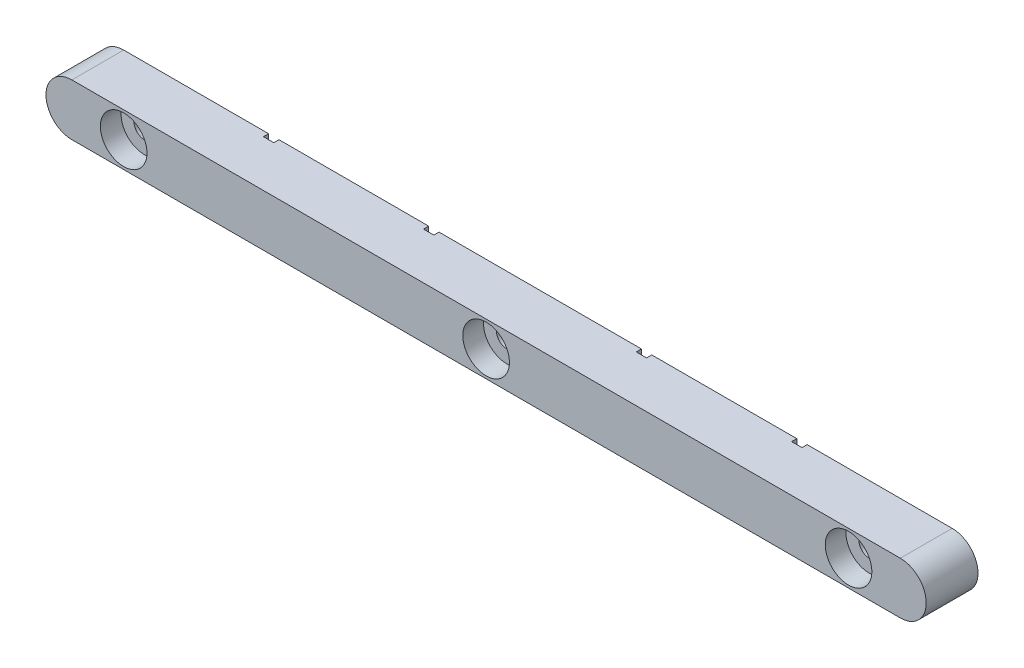
ISO-10303-21;
HEADER;
FILE_DESCRIPTION(('STEP AP214'),'2;1');
FILE_NAME('part.step','',(''),(''),'','','');
FILE_SCHEMA(('AUTOMOTIVE_DESIGN { 1 0 10303 214 1 1 1 1 }'));
ENDSEC;
DATA;
#1=APPLICATION_CONTEXT('core data for automotive mechanical design processes');
#2=APPLICATION_PROTOCOL_DEFINITION('international standard','automotive_design',2000,#1);
#3=PRODUCT_CONTEXT('',#1,'mechanical');
#4=PRODUCT('Part','Part','',(#3));
#5=PRODUCT_RELATED_PRODUCT_CATEGORY('part','',(#4));
#6=PRODUCT_DEFINITION_FORMATION('','',#4);
#7=PRODUCT_DEFINITION_CONTEXT('part definition',#1,'design');
#8=PRODUCT_DEFINITION('design','',#6,#7);
#9=PRODUCT_DEFINITION_SHAPE('','',#8);
#10=(LENGTH_UNIT() NAMED_UNIT(*) SI_UNIT(.MILLI.,.METRE.));
#11=(NAMED_UNIT(*) PLANE_ANGLE_UNIT() SI_UNIT($,.RADIAN.));
#12=(NAMED_UNIT(*) SI_UNIT($,.STERADIAN.) SOLID_ANGLE_UNIT());
#13=UNCERTAINTY_MEASURE_WITH_UNIT(LENGTH_MEASURE(1.E-05),#10,'distance_accuracy_value','');
#14=(GEOMETRIC_REPRESENTATION_CONTEXT(3) GLOBAL_UNCERTAINTY_ASSIGNED_CONTEXT((#13)) GLOBAL_UNIT_ASSIGNED_CONTEXT((#10,
#11,#12)) REPRESENTATION_CONTEXT('',''));
#15=CARTESIAN_POINT('',(0.,0.,0.));
#16=DIRECTION('',(0.,0.,1.));
#17=DIRECTION('',(1.,0.,0.));
#18=AXIS2_PLACEMENT_3D('',#15,#16,#17);
#19=CARTESIAN_POINT('',(-34.9999999999983,0.,5.));
#20=DIRECTION('',(0.,0.,-1.));
#21=DIRECTION('',(-1.,0.,0.));
#22=AXIS2_PLACEMENT_3D('',#19,#20,#21);
#23=CYLINDRICAL_SURFACE('',#22,0.999999999999998);
#24=CARTESIAN_POINT('',(-34.9999999999983,0.,0.));
#25=DIRECTION('',(0.,0.,1.));
#26=DIRECTION('',(1.,0.,0.));
#27=AXIS2_PLACEMENT_3D('',#24,#25,#26);
#28=CIRCLE('',#27,0.999999999999998);
#29=CARTESIAN_POINT('',(-33.9999999999983,0.,0.));
#30=VERTEX_POINT('',#29);
#31=EDGE_CURVE('E293',#30,#30,#28,.T.);
#32=ORIENTED_EDGE('',*,*,#31,.F.);
#33=EDGE_LOOP('',(#32));
#34=FACE_BOUND('',#33,.T.);
#35=CARTESIAN_POINT('',(-34.9999999999983,0.,3.));
#36=DIRECTION('',(0.,0.,1.));
#37=DIRECTION('',(1.,0.,0.));
#38=AXIS2_PLACEMENT_3D('',#35,#36,#37);
#39=CIRCLE('',#38,0.999999999999998);
#40=CARTESIAN_POINT('',(-33.9999999999983,0.,3.));
#41=VERTEX_POINT('',#40);
#42=EDGE_CURVE('E45',#41,#41,#39,.T.);
#43=ORIENTED_EDGE('',*,*,#42,.T.);
#44=EDGE_LOOP('',(#43));
#45=FACE_BOUND('',#44,.T.);
#46=ADVANCED_FACE('F41',(#34,#45),#23,.F.);
#47=CARTESIAN_POINT('',(0.,0.,5.));
#48=DIRECTION('',(0.,0.,-1.));
#49=DIRECTION('',(-1.,0.,0.));
#50=AXIS2_PLACEMENT_3D('',#47,#48,#49);
#51=CYLINDRICAL_SURFACE('',#50,1.);
#52=CARTESIAN_POINT('',(0.,0.,0.));
#53=DIRECTION('',(0.,0.,1.));
#54=DIRECTION('',(1.,0.,0.));
#55=AXIS2_PLACEMENT_3D('',#52,#53,#54);
#56=CIRCLE('',#55,1.);
#57=CARTESIAN_POINT('',(1.,0.,0.));
#58=VERTEX_POINT('',#57);
#59=EDGE_CURVE('E290',#58,#58,#56,.T.);
#60=ORIENTED_EDGE('',*,*,#59,.F.);
#61=EDGE_LOOP('',(#60));
#62=FACE_BOUND('',#61,.T.);
#63=CARTESIAN_POINT('',(0.,0.,3.));
#64=DIRECTION('',(0.,0.,1.));
#65=DIRECTION('',(1.,0.,0.));
#66=AXIS2_PLACEMENT_3D('',#63,#64,#65);
#67=CIRCLE('',#66,1.);
#68=CARTESIAN_POINT('',(1.,0.,3.));
#69=VERTEX_POINT('',#68);
#70=EDGE_CURVE('E330',#69,#69,#67,.T.);
#71=ORIENTED_EDGE('',*,*,#70,.T.);
#72=EDGE_LOOP('',(#71));
#73=FACE_BOUND('',#72,.T.);
#74=ADVANCED_FACE('F444',(#62,#73),#51,.F.);
#75=CARTESIAN_POINT('',(34.9999999999983,0.,5.));
#76=DIRECTION('',(0.,0.,-1.));
#77=DIRECTION('',(-1.,0.,0.));
#78=AXIS2_PLACEMENT_3D('',#75,#76,#77);
#79=CYLINDRICAL_SURFACE('',#78,0.999999999999998);
#80=CARTESIAN_POINT('',(34.9999999999983,0.,0.));
#81=DIRECTION('',(0.,0.,1.));
#82=DIRECTION('',(1.,0.,0.));
#83=AXIS2_PLACEMENT_3D('',#80,#81,#82);
#84=CIRCLE('',#83,0.999999999999998);
#85=CARTESIAN_POINT('',(35.9999999999983,0.,0.));
#86=VERTEX_POINT('',#85);
#87=EDGE_CURVE('E212',#86,#86,#84,.T.);
#88=ORIENTED_EDGE('',*,*,#87,.F.);
#89=EDGE_LOOP('',(#88));
#90=FACE_BOUND('',#89,.T.);
#91=CARTESIAN_POINT('',(34.9999999999983,0.,3.));
#92=DIRECTION('',(0.,0.,1.));
#93=DIRECTION('',(1.,0.,0.));
#94=AXIS2_PLACEMENT_3D('',#91,#92,#93);
#95=CIRCLE('',#94,0.999999999999998);
#96=CARTESIAN_POINT('',(35.9999999999983,0.,3.));
#97=VERTEX_POINT('',#96);
#98=EDGE_CURVE('E328',#97,#97,#95,.T.);
#99=ORIENTED_EDGE('',*,*,#98,.T.);
#100=EDGE_LOOP('',(#99));
#101=FACE_BOUND('',#100,.T.);
#102=ADVANCED_FACE('F435',(#90,#101),#79,.F.);
#103=CARTESIAN_POINT('',(-40.,0.,0.));
#104=DIRECTION('',(0.,0.,1.));
#105=DIRECTION('',(1.,0.,0.));
#106=AXIS2_PLACEMENT_3D('',#103,#104,#105);
#107=PLANE('',#106);
#108=ORIENTED_EDGE('',*,*,#87,.T.);
#109=EDGE_LOOP('',(#108));
#110=FACE_BOUND('',#109,.T.);
#111=DIRECTION('',(1.,0.,0.));
#112=VECTOR('',#111,1.);
#113=CARTESIAN_POINT('',(-40.,-2.5,0.));
#114=LINE('',#113,#112);
#115=CARTESIAN_POINT('',(26.,-2.5,0.));
#116=VERTEX_POINT('',#115);
#117=CARTESIAN_POINT('',(40.,-2.5,0.));
#118=VERTEX_POINT('',#117);
#119=EDGE_CURVE('E310',#116,#118,#114,.T.);
#120=ORIENTED_EDGE('',*,*,#119,.F.);
#121=DIRECTION('',(0.,-1.,0.));
#122=VECTOR('',#121,1.);
#123=CARTESIAN_POINT('',(26.,2.5,0.));
#124=LINE('',#123,#122);
#125=CARTESIAN_POINT('',(26.,2.5,0.));
#126=VERTEX_POINT('',#125);
#127=EDGE_CURVE('E186',#126,#116,#124,.T.);
#128=ORIENTED_EDGE('',*,*,#127,.F.);
#129=DIRECTION('',(-1.,0.,0.));
#130=VECTOR('',#129,1.);
#131=CARTESIAN_POINT('',(-40.,2.5,0.));
#132=LINE('',#131,#130);
#133=CARTESIAN_POINT('',(40.,2.5,0.));
#134=VERTEX_POINT('',#133);
#135=EDGE_CURVE('E301',#134,#126,#132,.T.);
#136=ORIENTED_EDGE('',*,*,#135,.F.);
#137=CARTESIAN_POINT('',(40.0000000920344,0.,0.));
#138=DIRECTION('',(0.,0.,1.));
#139=DIRECTION('',(-1.,0.,0.));
#140=AXIS2_PLACEMENT_3D('',#137,#138,#139);
#141=CIRCLE('',#140,2.5);
#142=EDGE_CURVE('E314',#118,#134,#141,.T.);
#143=ORIENTED_EDGE('',*,*,#142,.F.);
#144=EDGE_LOOP('',(#120,#128,#136,#143));
#145=FACE_BOUND('',#144,.T.);
#146=ADVANCED_FACE('F433',(#110,#145),#107,.F.);
#147=CARTESIAN_POINT('',(25.,2.5,0.));
#148=VERTEX_POINT('',#147);
#149=CARTESIAN_POINT('',(11.,2.5,0.));
#150=VERTEX_POINT('',#149);
#151=EDGE_CURVE('E320',#148,#150,#132,.T.);
#152=ORIENTED_EDGE('',*,*,#151,.F.);
#153=DIRECTION('',(0.,1.,0.));
#154=VECTOR('',#153,1.);
#155=CARTESIAN_POINT('',(25.,2.5,0.));
#156=LINE('',#155,#154);
#157=CARTESIAN_POINT('',(25.,-2.5,0.));
#158=VERTEX_POINT('',#157);
#159=EDGE_CURVE('E198',#158,#148,#156,.T.);
#160=ORIENTED_EDGE('',*,*,#159,.F.);
#161=CARTESIAN_POINT('',(11.,-2.5,0.));
#162=VERTEX_POINT('',#161);
#163=EDGE_CURVE('E418',#162,#158,#114,.T.);
#164=ORIENTED_EDGE('',*,*,#163,.F.);
#165=DIRECTION('',(0.,-1.,0.));
#166=VECTOR('',#165,1.);
#167=CARTESIAN_POINT('',(11.,2.5,0.));
#168=LINE('',#167,#166);
#169=EDGE_CURVE('E208',#150,#162,#168,.T.);
#170=ORIENTED_EDGE('',*,*,#169,.F.);
#171=EDGE_LOOP('',(#152,#160,#164,#170));
#172=FACE_BOUND('',#171,.T.);
#173=ADVANCED_FACE('F427',(#172),#107,.F.);
#174=ORIENTED_EDGE('',*,*,#59,.T.);
#175=EDGE_LOOP('',(#174));
#176=FACE_BOUND('',#175,.T.);
#177=CARTESIAN_POINT('',(10.,2.5,0.));
#178=VERTEX_POINT('',#177);
#179=CARTESIAN_POINT('',(-9.54456505478342,2.5,0.));
#180=VERTEX_POINT('',#179);
#181=EDGE_CURVE('E707',#178,#180,#132,.T.);
#182=ORIENTED_EDGE('',*,*,#181,.F.);
#183=DIRECTION('',(0.,1.,0.));
#184=VECTOR('',#183,1.);
#185=CARTESIAN_POINT('',(10.,2.5,0.));
#186=LINE('',#185,#184);
#187=CARTESIAN_POINT('',(10.,-2.5,0.));
#188=VERTEX_POINT('',#187);
#189=EDGE_CURVE('E229',#188,#178,#186,.T.);
#190=ORIENTED_EDGE('',*,*,#189,.F.);
#191=CARTESIAN_POINT('',(-9.54456505478342,-2.5,0.));
#192=VERTEX_POINT('',#191);
#193=EDGE_CURVE('E416',#192,#188,#114,.T.);
#194=ORIENTED_EDGE('',*,*,#193,.F.);
#195=DIRECTION('',(0.,-1.,0.));
#196=VECTOR('',#195,1.);
#197=CARTESIAN_POINT('',(-9.54456505478342,2.5,0.));
#198=LINE('',#197,#196);
#199=EDGE_CURVE('E228',#180,#192,#198,.T.);
#200=ORIENTED_EDGE('',*,*,#199,.F.);
#201=EDGE_LOOP('',(#182,#190,#194,#200));
#202=FACE_BOUND('',#201,.T.);
#203=ADVANCED_FACE('F442',(#176,#202),#107,.F.);
#204=CARTESIAN_POINT('',(-10.5445650547834,2.5,0.));
#205=VERTEX_POINT('',#204);
#206=CARTESIAN_POINT('',(-25.,2.5,0.));
#207=VERTEX_POINT('',#206);
#208=EDGE_CURVE('E709',#205,#207,#132,.T.);
#209=ORIENTED_EDGE('',*,*,#208,.F.);
#210=DIRECTION('',(0.,1.,0.));
#211=VECTOR('',#210,1.);
#212=CARTESIAN_POINT('',(-10.5445650547834,2.5,0.));
#213=LINE('',#212,#211);
#214=CARTESIAN_POINT('',(-10.5445650547834,-2.5,0.));
#215=VERTEX_POINT('',#214);
#216=EDGE_CURVE('E251',#215,#205,#213,.T.);
#217=ORIENTED_EDGE('',*,*,#216,.F.);
#218=CARTESIAN_POINT('',(-25.,-2.5,0.));
#219=VERTEX_POINT('',#218);
#220=EDGE_CURVE('E315',#219,#215,#114,.T.);
#221=ORIENTED_EDGE('',*,*,#220,.F.);
#222=DIRECTION('',(0.,-1.,0.));
#223=VECTOR('',#222,1.);
#224=CARTESIAN_POINT('',(-25.,2.5,0.));
#225=LINE('',#224,#223);
#226=EDGE_CURVE('E250',#207,#219,#225,.T.);
#227=ORIENTED_EDGE('',*,*,#226,.F.);
#228=EDGE_LOOP('',(#209,#217,#221,#227));
#229=FACE_BOUND('',#228,.T.);
#230=ADVANCED_FACE('F376',(#229),#107,.F.);
#231=CARTESIAN_POINT('',(-40.,0.,5.));
#232=DIRECTION('',(0.,0.,1.));
#233=DIRECTION('',(1.,0.,0.));
#234=AXIS2_PLACEMENT_3D('',#231,#232,#233);
#235=PLANE('',#234);
#236=CARTESIAN_POINT('',(-34.9999999999983,0.,5.));
#237=DIRECTION('',(0.,0.,1.));
#238=DIRECTION('',(1.,0.,0.));
#239=AXIS2_PLACEMENT_3D('',#236,#237,#238);
#240=CIRCLE('',#239,2.25);
#241=CARTESIAN_POINT('',(-32.7499999999983,0.,5.));
#242=VERTEX_POINT('',#241);
#243=EDGE_CURVE('E347',#242,#242,#240,.T.);
#244=ORIENTED_EDGE('',*,*,#243,.F.);
#245=EDGE_LOOP('',(#244));
#246=FACE_BOUND('',#245,.T.);
#247=CARTESIAN_POINT('',(0.,0.,5.));
#248=DIRECTION('',(0.,0.,1.));
#249=DIRECTION('',(1.,0.,0.));
#250=AXIS2_PLACEMENT_3D('',#247,#248,#249);
#251=CIRCLE('',#250,2.25);
#252=CARTESIAN_POINT('',(2.25,0.,5.));
#253=VERTEX_POINT('',#252);
#254=EDGE_CURVE('E350',#253,#253,#251,.T.);
#255=ORIENTED_EDGE('',*,*,#254,.F.);
#256=EDGE_LOOP('',(#255));
#257=FACE_BOUND('',#256,.T.);
#258=CARTESIAN_POINT('',(34.9999999999983,0.,5.));
#259=DIRECTION('',(0.,0.,1.));
#260=DIRECTION('',(1.,0.,0.));
#261=AXIS2_PLACEMENT_3D('',#258,#259,#260);
#262=CIRCLE('',#261,2.25);
#263=CARTESIAN_POINT('',(37.2499999999983,0.,5.));
#264=VERTEX_POINT('',#263);
#265=EDGE_CURVE('E358',#264,#264,#262,.T.);
#266=ORIENTED_EDGE('',*,*,#265,.F.);
#267=EDGE_LOOP('',(#266));
#268=FACE_BOUND('',#267,.T.);
#269=CARTESIAN_POINT('',(-40.,0.,5.));
#270=DIRECTION('',(0.,0.,1.));
#271=DIRECTION('',(1.,0.,0.));
#272=AXIS2_PLACEMENT_3D('',#269,#270,#271);
#273=CIRCLE('',#272,2.5);
#274=CARTESIAN_POINT('',(-40.,2.5,5.));
#275=VERTEX_POINT('',#274);
#276=CARTESIAN_POINT('',(-40.,-2.5,5.));
#277=VERTEX_POINT('',#276);
#278=EDGE_CURVE('E297',#275,#277,#273,.T.);
#279=ORIENTED_EDGE('',*,*,#278,.T.);
#280=DIRECTION('',(1.,0.,0.));
#281=VECTOR('',#280,1.);
#282=CARTESIAN_POINT('',(-40.,-2.5,5.));
#283=LINE('',#282,#281);
#284=CARTESIAN_POINT('',(40.,-2.5,5.));
#285=VERTEX_POINT('',#284);
#286=EDGE_CURVE('E300',#277,#285,#283,.T.);
#287=ORIENTED_EDGE('',*,*,#286,.T.);
#288=CARTESIAN_POINT('',(40.0000000920344,0.,5.));
#289=DIRECTION('',(0.,0.,1.));
#290=DIRECTION('',(-1.,0.,0.));
#291=AXIS2_PLACEMENT_3D('',#288,#289,#290);
#292=CIRCLE('',#291,2.5);
#293=CARTESIAN_POINT('',(40.,2.5,5.));
#294=VERTEX_POINT('',#293);
#295=EDGE_CURVE('E303',#285,#294,#292,.T.);
#296=ORIENTED_EDGE('',*,*,#295,.T.);
#297=DIRECTION('',(-1.,0.,0.));
#298=VECTOR('',#297,1.);
#299=CARTESIAN_POINT('',(-40.,2.5,5.));
#300=LINE('',#299,#298);
#301=EDGE_CURVE('E305',#294,#275,#300,.T.);
#302=ORIENTED_EDGE('',*,*,#301,.T.);
#303=EDGE_LOOP('',(#279,#287,#296,#302));
#304=FACE_BOUND('',#303,.T.);
#305=ADVANCED_FACE('F372',(#246,#257,#268,#304),#235,.T.);
#306=CARTESIAN_POINT('',(-26.,2.5,0.));
#307=VERTEX_POINT('',#306);
#308=CARTESIAN_POINT('',(-40.,2.5,0.));
#309=VERTEX_POINT('',#308);
#310=EDGE_CURVE('E317',#307,#309,#132,.T.);
#311=ORIENTED_EDGE('',*,*,#310,.F.);
#312=DIRECTION('',(0.,1.,0.));
#313=VECTOR('',#312,1.);
#314=CARTESIAN_POINT('',(-26.,2.5,0.));
#315=LINE('',#314,#313);
#316=CARTESIAN_POINT('',(-26.,-2.5,0.));
#317=VERTEX_POINT('',#316);
#318=EDGE_CURVE('E275',#317,#307,#315,.T.);
#319=ORIENTED_EDGE('',*,*,#318,.F.);
#320=CARTESIAN_POINT('',(-40.,-2.5,0.));
#321=VERTEX_POINT('',#320);
#322=EDGE_CURVE('E311',#321,#317,#114,.T.);
#323=ORIENTED_EDGE('',*,*,#322,.F.);
#324=CARTESIAN_POINT('',(-40.,0.,0.));
#325=DIRECTION('',(0.,0.,1.));
#326=DIRECTION('',(1.,0.,0.));
#327=AXIS2_PLACEMENT_3D('',#324,#325,#326);
#328=CIRCLE('',#327,2.5);
#329=EDGE_CURVE('E296',#309,#321,#328,.T.);
#330=ORIENTED_EDGE('',*,*,#329,.F.);
#331=EDGE_LOOP('',(#311,#319,#323,#330));
#332=FACE_BOUND('',#331,.T.);
#333=ORIENTED_EDGE('',*,*,#31,.T.);
#334=EDGE_LOOP('',(#333));
#335=FACE_BOUND('',#334,.T.);
#336=ADVANCED_FACE('F375',(#332,#335),#107,.F.);
#337=CARTESIAN_POINT('',(-40.,0.,5.));
#338=DIRECTION('',(0.,0.,-1.));
#339=DIRECTION('',(-1.,0.,0.));
#340=AXIS2_PLACEMENT_3D('',#337,#338,#339);
#341=CYLINDRICAL_SURFACE('',#340,2.5);
#342=ORIENTED_EDGE('',*,*,#329,.T.);
#343=DIRECTION('',(0.,0.,-1.));
#344=VECTOR('',#343,1.);
#345=CARTESIAN_POINT('',(-40.,-2.5,5.));
#346=LINE('',#345,#344);
#347=EDGE_CURVE('E11',#277,#321,#346,.T.);
#348=ORIENTED_EDGE('',*,*,#347,.F.);
#349=ORIENTED_EDGE('',*,*,#278,.F.);
#350=DIRECTION('',(0.,0.,-1.));
#351=VECTOR('',#350,1.);
#352=CARTESIAN_POINT('',(-40.,2.5,5.));
#353=LINE('',#352,#351);
#354=EDGE_CURVE('E307',#275,#309,#353,.T.);
#355=ORIENTED_EDGE('',*,*,#354,.T.);
#356=EDGE_LOOP('',(#342,#348,#349,#355));
#357=FACE_BOUND('',#356,.T.);
#358=ADVANCED_FACE('F43',(#357),#341,.T.);
#359=CARTESIAN_POINT('',(-40.,-2.5,5.));
#360=DIRECTION('',(0.,1.,0.));
#361=DIRECTION('',(0.,0.,1.));
#362=AXIS2_PLACEMENT_3D('',#359,#360,#361);
#363=PLANE('',#362);
#364=DIRECTION('',(-1.,0.,0.));
#365=VECTOR('',#364,1.);
#366=CARTESIAN_POINT('',(26.,-2.5,0.5));
#367=LINE('',#366,#365);
#368=CARTESIAN_POINT('',(26.,-2.5,0.5));
#369=VERTEX_POINT('',#368);
#370=CARTESIAN_POINT('',(25.,-2.5,0.5));
#371=VERTEX_POINT('',#370);
#372=EDGE_CURVE('E194',#369,#371,#367,.T.);
#373=ORIENTED_EDGE('',*,*,#372,.F.);
#374=DIRECTION('',(0.,0.,-1.));
#375=VECTOR('',#374,1.);
#376=CARTESIAN_POINT('',(26.,-2.5,0.5));
#377=LINE('',#376,#375);
#378=EDGE_CURVE('E181',#369,#116,#377,.T.);
#379=ORIENTED_EDGE('',*,*,#378,.T.);
#380=ORIENTED_EDGE('',*,*,#119,.T.);
#381=DIRECTION('',(0.,0.,-1.));
#382=VECTOR('',#381,1.);
#383=CARTESIAN_POINT('',(40.,-2.5,5.));
#384=LINE('',#383,#382);
#385=EDGE_CURVE('E50',#285,#118,#384,.T.);
#386=ORIENTED_EDGE('',*,*,#385,.F.);
#387=ORIENTED_EDGE('',*,*,#286,.F.);
#388=ORIENTED_EDGE('',*,*,#347,.T.);
#389=ORIENTED_EDGE('',*,*,#322,.T.);
#390=DIRECTION('',(0.,0.,-1.));
#391=VECTOR('',#390,1.);
#392=CARTESIAN_POINT('',(-26.,-2.5,0.5));
#393=LINE('',#392,#391);
#394=CARTESIAN_POINT('',(-26.,-2.5,0.5));
#395=VERTEX_POINT('',#394);
#396=EDGE_CURVE('E268',#395,#317,#393,.T.);
#397=ORIENTED_EDGE('',*,*,#396,.F.);
#398=DIRECTION('',(-1.,0.,0.));
#399=VECTOR('',#398,1.);
#400=CARTESIAN_POINT('',(-25.,-2.5,0.5));
#401=LINE('',#400,#399);
#402=CARTESIAN_POINT('',(-25.,-2.5,0.5));
#403=VERTEX_POINT('',#402);
#404=EDGE_CURVE('E283',#403,#395,#401,.T.);
#405=ORIENTED_EDGE('',*,*,#404,.F.);
#406=DIRECTION('',(0.,0.,-1.));
#407=VECTOR('',#406,1.);
#408=CARTESIAN_POINT('',(-25.,-2.5,0.5));
#409=LINE('',#408,#407);
#410=EDGE_CURVE('E264',#403,#219,#409,.T.);
#411=ORIENTED_EDGE('',*,*,#410,.T.);
#412=ORIENTED_EDGE('',*,*,#220,.T.);
#413=DIRECTION('',(0.,0.,-1.));
#414=VECTOR('',#413,1.);
#415=CARTESIAN_POINT('',(-10.5445650547834,-2.5,0.5));
#416=LINE('',#415,#414);
#417=CARTESIAN_POINT('',(-10.5445650547834,-2.5,0.5));
#418=VERTEX_POINT('',#417);
#419=EDGE_CURVE('E243',#418,#215,#416,.T.);
#420=ORIENTED_EDGE('',*,*,#419,.F.);
#421=DIRECTION('',(-1.,0.,0.));
#422=VECTOR('',#421,1.);
#423=CARTESIAN_POINT('',(-9.54456505478342,-2.5,0.5));
#424=LINE('',#423,#422);
#425=CARTESIAN_POINT('',(-9.54456505478342,-2.5,0.5));
#426=VERTEX_POINT('',#425);
#427=EDGE_CURVE('E259',#426,#418,#424,.T.);
#428=ORIENTED_EDGE('',*,*,#427,.F.);
#429=DIRECTION('',(0.,0.,-1.));
#430=VECTOR('',#429,1.);
#431=CARTESIAN_POINT('',(-9.54456505478342,-2.5,0.5));
#432=LINE('',#431,#430);
#433=EDGE_CURVE('E239',#426,#192,#432,.T.);
#434=ORIENTED_EDGE('',*,*,#433,.T.);
#435=ORIENTED_EDGE('',*,*,#193,.T.);
#436=DIRECTION('',(0.,0.,-1.));
#437=VECTOR('',#436,1.);
#438=CARTESIAN_POINT('',(10.,-2.5,0.5));
#439=LINE('',#438,#437);
#440=CARTESIAN_POINT('',(10.,-2.5,0.5));
#441=VERTEX_POINT('',#440);
#442=EDGE_CURVE('E221',#441,#188,#439,.T.);
#443=ORIENTED_EDGE('',*,*,#442,.F.);
#444=DIRECTION('',(-1.,0.,0.));
#445=VECTOR('',#444,1.);
#446=CARTESIAN_POINT('',(11.,-2.5,0.5));
#447=LINE('',#446,#445);
#448=CARTESIAN_POINT('',(11.,-2.5,0.5));
#449=VERTEX_POINT('',#448);
#450=EDGE_CURVE('E235',#449,#441,#447,.T.);
#451=ORIENTED_EDGE('',*,*,#450,.F.);
#452=DIRECTION('',(0.,0.,-1.));
#453=VECTOR('',#452,1.);
#454=CARTESIAN_POINT('',(11.,-2.5,0.5));
#455=LINE('',#454,#453);
#456=EDGE_CURVE('E217',#449,#162,#455,.T.);
#457=ORIENTED_EDGE('',*,*,#456,.T.);
#458=ORIENTED_EDGE('',*,*,#163,.T.);
#459=DIRECTION('',(0.,0.,-1.));
#460=VECTOR('',#459,1.);
#461=CARTESIAN_POINT('',(25.,-2.5,0.5));
#462=LINE('',#461,#460);
#463=EDGE_CURVE('E190',#371,#158,#462,.T.);
#464=ORIENTED_EDGE('',*,*,#463,.F.);
#465=EDGE_LOOP('',(#373,#379,#380,#386,#387,#388,#389,#397,#405,#411,#412,#420,#428,#434,#435,
#443,#451,#457,#458,#464));
#466=FACE_BOUND('',#465,.T.);
#467=ADVANCED_FACE('F200',(#466),#363,.F.);
#468=CARTESIAN_POINT('',(40.0000000920344,0.,5.));
#469=DIRECTION('',(0.,0.,-1.));
#470=DIRECTION('',(-1.,0.,0.));
#471=AXIS2_PLACEMENT_3D('',#468,#469,#470);
#472=CYLINDRICAL_SURFACE('',#471,2.5);
#473=ORIENTED_EDGE('',*,*,#142,.T.);
#474=DIRECTION('',(0.,0.,-1.));
#475=VECTOR('',#474,1.);
#476=CARTESIAN_POINT('',(40.,2.5,5.));
#477=LINE('',#476,#475);
#478=EDGE_CURVE('E323',#294,#134,#477,.T.);
#479=ORIENTED_EDGE('',*,*,#478,.F.);
#480=ORIENTED_EDGE('',*,*,#295,.F.);
#481=ORIENTED_EDGE('',*,*,#385,.T.);
#482=EDGE_LOOP('',(#473,#479,#480,#481));
#483=FACE_BOUND('',#482,.T.);
#484=ADVANCED_FACE('F391',(#483),#472,.T.);
#485=CARTESIAN_POINT('',(-40.,2.5,5.));
#486=DIRECTION('',(0.,-1.,0.));
#487=DIRECTION('',(0.,0.,-1.));
#488=AXIS2_PLACEMENT_3D('',#485,#486,#487);
#489=PLANE('',#488);
#490=ORIENTED_EDGE('',*,*,#135,.T.);
#491=DIRECTION('',(0.,0.,-1.));
#492=VECTOR('',#491,1.);
#493=CARTESIAN_POINT('',(26.,2.5,0.5));
#494=LINE('',#493,#492);
#495=CARTESIAN_POINT('',(26.,2.5,0.5));
#496=VERTEX_POINT('',#495);
#497=EDGE_CURVE('E210',#496,#126,#494,.T.);
#498=ORIENTED_EDGE('',*,*,#497,.F.);
#499=DIRECTION('',(1.,0.,0.));
#500=VECTOR('',#499,1.);
#501=CARTESIAN_POINT('',(26.,2.5,0.5));
#502=LINE('',#501,#500);
#503=CARTESIAN_POINT('',(25.,2.5,0.5));
#504=VERTEX_POINT('',#503);
#505=EDGE_CURVE('E191',#504,#496,#502,.T.);
#506=ORIENTED_EDGE('',*,*,#505,.F.);
#507=DIRECTION('',(0.,0.,-1.));
#508=VECTOR('',#507,1.);
#509=CARTESIAN_POINT('',(25.,2.5,0.5));
#510=LINE('',#509,#508);
#511=EDGE_CURVE('E213',#504,#148,#510,.T.);
#512=ORIENTED_EDGE('',*,*,#511,.T.);
#513=ORIENTED_EDGE('',*,*,#151,.T.);
#514=DIRECTION('',(0.,0.,-1.));
#515=VECTOR('',#514,1.);
#516=CARTESIAN_POINT('',(11.,2.5,0.5));
#517=LINE('',#516,#515);
#518=CARTESIAN_POINT('',(11.,2.5,0.5));
#519=VERTEX_POINT('',#518);
#520=EDGE_CURVE('E226',#519,#150,#517,.T.);
#521=ORIENTED_EDGE('',*,*,#520,.F.);
#522=DIRECTION('',(1.,0.,0.));
#523=VECTOR('',#522,1.);
#524=CARTESIAN_POINT('',(11.,2.5,0.5));
#525=LINE('',#524,#523);
#526=CARTESIAN_POINT('',(10.,2.5,0.5));
#527=VERTEX_POINT('',#526);
#528=EDGE_CURVE('E220',#527,#519,#525,.T.);
#529=ORIENTED_EDGE('',*,*,#528,.F.);
#530=DIRECTION('',(0.,0.,-1.));
#531=VECTOR('',#530,1.);
#532=CARTESIAN_POINT('',(10.,2.5,0.5));
#533=LINE('',#532,#531);
#534=EDGE_CURVE('E223',#527,#178,#533,.T.);
#535=ORIENTED_EDGE('',*,*,#534,.T.);
#536=ORIENTED_EDGE('',*,*,#181,.T.);
#537=DIRECTION('',(0.,0.,-1.));
#538=VECTOR('',#537,1.);
#539=CARTESIAN_POINT('',(-9.54456505478342,2.5,0.5));
#540=LINE('',#539,#538);
#541=CARTESIAN_POINT('',(-9.54456505478342,2.5,0.5));
#542=VERTEX_POINT('',#541);
#543=EDGE_CURVE('E248',#542,#180,#540,.T.);
#544=ORIENTED_EDGE('',*,*,#543,.F.);
#545=DIRECTION('',(1.,0.,0.));
#546=VECTOR('',#545,1.);
#547=CARTESIAN_POINT('',(-9.54456505478342,2.5,0.5));
#548=LINE('',#547,#546);
#549=CARTESIAN_POINT('',(-10.5445650547834,2.5,0.5));
#550=VERTEX_POINT('',#549);
#551=EDGE_CURVE('E242',#550,#542,#548,.T.);
#552=ORIENTED_EDGE('',*,*,#551,.F.);
#553=DIRECTION('',(0.,0.,-1.));
#554=VECTOR('',#553,1.);
#555=CARTESIAN_POINT('',(-10.5445650547834,2.5,0.5));
#556=LINE('',#555,#554);
#557=EDGE_CURVE('E245',#550,#205,#556,.T.);
#558=ORIENTED_EDGE('',*,*,#557,.T.);
#559=ORIENTED_EDGE('',*,*,#208,.T.);
#560=DIRECTION('',(0.,0.,-1.));
#561=VECTOR('',#560,1.);
#562=CARTESIAN_POINT('',(-25.,2.5,0.5));
#563=LINE('',#562,#561);
#564=CARTESIAN_POINT('',(-25.,2.5,0.5));
#565=VERTEX_POINT('',#564);
#566=EDGE_CURVE('E273',#565,#207,#563,.T.);
#567=ORIENTED_EDGE('',*,*,#566,.F.);
#568=DIRECTION('',(1.,0.,0.));
#569=VECTOR('',#568,1.);
#570=CARTESIAN_POINT('',(-25.,2.5,0.5));
#571=LINE('',#570,#569);
#572=CARTESIAN_POINT('',(-26.,2.5,0.5));
#573=VERTEX_POINT('',#572);
#574=EDGE_CURVE('E267',#573,#565,#571,.T.);
#575=ORIENTED_EDGE('',*,*,#574,.F.);
#576=DIRECTION('',(0.,0.,-1.));
#577=VECTOR('',#576,1.);
#578=CARTESIAN_POINT('',(-26.,2.5,0.5));
#579=LINE('',#578,#577);
#580=EDGE_CURVE('E270',#573,#307,#579,.T.);
#581=ORIENTED_EDGE('',*,*,#580,.T.);
#582=ORIENTED_EDGE('',*,*,#310,.T.);
#583=ORIENTED_EDGE('',*,*,#354,.F.);
#584=ORIENTED_EDGE('',*,*,#301,.F.);
#585=ORIENTED_EDGE('',*,*,#478,.T.);
#586=EDGE_LOOP('',(#490,#498,#506,#512,#513,#521,#529,#535,#536,#544,#552,#558,#559,#567,#575,
#581,#582,#583,#584,#585));
#587=FACE_BOUND('',#586,.T.);
#588=ADVANCED_FACE('F394',(#587),#489,.F.);
#589=CARTESIAN_POINT('',(-25.,2.5,0.5));
#590=DIRECTION('',(1.,0.,0.));
#591=DIRECTION('',(0.,0.,-1.));
#592=AXIS2_PLACEMENT_3D('',#589,#590,#591);
#593=PLANE('',#592);
#594=ORIENTED_EDGE('',*,*,#226,.T.);
#595=ORIENTED_EDGE('',*,*,#410,.F.);
#596=DIRECTION('',(0.,-1.,0.));
#597=VECTOR('',#596,1.);
#598=CARTESIAN_POINT('',(-25.,2.5,0.5));
#599=LINE('',#598,#597);
#600=EDGE_CURVE('E277',#565,#403,#599,.T.);
#601=ORIENTED_EDGE('',*,*,#600,.F.);
#602=ORIENTED_EDGE('',*,*,#566,.T.);
#603=EDGE_LOOP('',(#594,#595,#601,#602));
#604=FACE_BOUND('',#603,.T.);
#605=ADVANCED_FACE('F465',(#604),#593,.F.);
#606=CARTESIAN_POINT('',(-26.,2.5,0.5));
#607=DIRECTION('',(-1.,0.,0.));
#608=DIRECTION('',(0.,0.,1.));
#609=AXIS2_PLACEMENT_3D('',#606,#607,#608);
#610=PLANE('',#609);
#611=ORIENTED_EDGE('',*,*,#318,.T.);
#612=ORIENTED_EDGE('',*,*,#580,.F.);
#613=DIRECTION('',(0.,1.,0.));
#614=VECTOR('',#613,1.);
#615=CARTESIAN_POINT('',(-26.,2.5,0.5));
#616=LINE('',#615,#614);
#617=EDGE_CURVE('E281',#395,#573,#616,.T.);
#618=ORIENTED_EDGE('',*,*,#617,.F.);
#619=ORIENTED_EDGE('',*,*,#396,.T.);
#620=EDGE_LOOP('',(#611,#612,#618,#619));
#621=FACE_BOUND('',#620,.T.);
#622=ADVANCED_FACE('F401',(#621),#610,.F.);
#623=CARTESIAN_POINT('',(0.,0.,0.5));
#624=DIRECTION('',(0.,0.,-1.));
#625=DIRECTION('',(-1.,0.,0.));
#626=AXIS2_PLACEMENT_3D('',#623,#624,#625);
#627=PLANE('',#626);
#628=ORIENTED_EDGE('',*,*,#600,.T.);
#629=ORIENTED_EDGE('',*,*,#404,.T.);
#630=ORIENTED_EDGE('',*,*,#617,.T.);
#631=ORIENTED_EDGE('',*,*,#574,.T.);
#632=EDGE_LOOP('',(#628,#629,#630,#631));
#633=FACE_BOUND('',#632,.T.);
#634=ADVANCED_FACE('F406',(#633),#627,.T.);
#635=CARTESIAN_POINT('',(-9.54456505478342,2.5,0.5));
#636=DIRECTION('',(1.,0.,0.));
#637=DIRECTION('',(0.,0.,-1.));
#638=AXIS2_PLACEMENT_3D('',#635,#636,#637);
#639=PLANE('',#638);
#640=ORIENTED_EDGE('',*,*,#199,.T.);
#641=ORIENTED_EDGE('',*,*,#433,.F.);
#642=DIRECTION('',(0.,-1.,0.));
#643=VECTOR('',#642,1.);
#644=CARTESIAN_POINT('',(-9.54456505478342,2.5,0.5));
#645=LINE('',#644,#643);
#646=EDGE_CURVE('E253',#542,#426,#645,.T.);
#647=ORIENTED_EDGE('',*,*,#646,.F.);
#648=ORIENTED_EDGE('',*,*,#543,.T.);
#649=EDGE_LOOP('',(#640,#641,#647,#648));
#650=FACE_BOUND('',#649,.T.);
#651=ADVANCED_FACE('F462',(#650),#639,.F.);
#652=CARTESIAN_POINT('',(-10.5445650547834,2.5,0.5));
#653=DIRECTION('',(-1.,0.,0.));
#654=DIRECTION('',(0.,0.,1.));
#655=AXIS2_PLACEMENT_3D('',#652,#653,#654);
#656=PLANE('',#655);
#657=ORIENTED_EDGE('',*,*,#216,.T.);
#658=ORIENTED_EDGE('',*,*,#557,.F.);
#659=DIRECTION('',(0.,1.,0.));
#660=VECTOR('',#659,1.);
#661=CARTESIAN_POINT('',(-10.5445650547834,2.5,0.5));
#662=LINE('',#661,#660);
#663=EDGE_CURVE('E257',#418,#550,#662,.T.);
#664=ORIENTED_EDGE('',*,*,#663,.F.);
#665=ORIENTED_EDGE('',*,*,#419,.T.);
#666=EDGE_LOOP('',(#657,#658,#664,#665));
#667=FACE_BOUND('',#666,.T.);
#668=ADVANCED_FACE('F472',(#667),#656,.F.);
#669=CARTESIAN_POINT('',(0.,0.,0.5));
#670=DIRECTION('',(0.,0.,-1.));
#671=DIRECTION('',(-1.,0.,0.));
#672=AXIS2_PLACEMENT_3D('',#669,#670,#671);
#673=PLANE('',#672);
#674=ORIENTED_EDGE('',*,*,#646,.T.);
#675=ORIENTED_EDGE('',*,*,#427,.T.);
#676=ORIENTED_EDGE('',*,*,#663,.T.);
#677=ORIENTED_EDGE('',*,*,#551,.T.);
#678=EDGE_LOOP('',(#674,#675,#676,#677));
#679=FACE_BOUND('',#678,.T.);
#680=ADVANCED_FACE('F468',(#679),#673,.T.);
#681=CARTESIAN_POINT('',(11.,2.5,0.5));
#682=DIRECTION('',(1.,0.,0.));
#683=DIRECTION('',(0.,0.,-1.));
#684=AXIS2_PLACEMENT_3D('',#681,#682,#683);
#685=PLANE('',#684);
#686=ORIENTED_EDGE('',*,*,#169,.T.);
#687=ORIENTED_EDGE('',*,*,#456,.F.);
#688=DIRECTION('',(0.,-1.,0.));
#689=VECTOR('',#688,1.);
#690=CARTESIAN_POINT('',(11.,2.5,0.5));
#691=LINE('',#690,#689);
#692=EDGE_CURVE('E231',#519,#449,#691,.T.);
#693=ORIENTED_EDGE('',*,*,#692,.F.);
#694=ORIENTED_EDGE('',*,*,#520,.T.);
#695=EDGE_LOOP('',(#686,#687,#693,#694));
#696=FACE_BOUND('',#695,.T.);
#697=ADVANCED_FACE('F471',(#696),#685,.F.);
#698=CARTESIAN_POINT('',(10.,2.5,0.5));
#699=DIRECTION('',(-1.,0.,0.));
#700=DIRECTION('',(0.,-1.,0.));
#701=AXIS2_PLACEMENT_3D('',#698,#699,#700);
#702=PLANE('',#701);
#703=ORIENTED_EDGE('',*,*,#189,.T.);
#704=ORIENTED_EDGE('',*,*,#534,.F.);
#705=DIRECTION('',(0.,1.,0.));
#706=VECTOR('',#705,1.);
#707=CARTESIAN_POINT('',(10.,2.5,0.5));
#708=LINE('',#707,#706);
#709=EDGE_CURVE('E66',#441,#527,#708,.T.);
#710=ORIENTED_EDGE('',*,*,#709,.F.);
#711=ORIENTED_EDGE('',*,*,#442,.T.);
#712=EDGE_LOOP('',(#703,#704,#710,#711));
#713=FACE_BOUND('',#712,.T.);
#714=ADVANCED_FACE('F483',(#713),#702,.F.);
#715=CARTESIAN_POINT('',(0.,0.,0.5));
#716=DIRECTION('',(0.,0.,-1.));
#717=DIRECTION('',(-1.,0.,0.));
#718=AXIS2_PLACEMENT_3D('',#715,#716,#717);
#719=PLANE('',#718);
#720=ORIENTED_EDGE('',*,*,#692,.T.);
#721=ORIENTED_EDGE('',*,*,#450,.T.);
#722=ORIENTED_EDGE('',*,*,#709,.T.);
#723=ORIENTED_EDGE('',*,*,#528,.T.);
#724=EDGE_LOOP('',(#720,#721,#722,#723));
#725=FACE_BOUND('',#724,.T.);
#726=ADVANCED_FACE('F480',(#725),#719,.T.);
#727=CARTESIAN_POINT('',(26.,2.5,0.5));
#728=DIRECTION('',(1.,0.,0.));
#729=DIRECTION('',(0.,0.,-1.));
#730=AXIS2_PLACEMENT_3D('',#727,#728,#729);
#731=PLANE('',#730);
#732=ORIENTED_EDGE('',*,*,#127,.T.);
#733=ORIENTED_EDGE('',*,*,#378,.F.);
#734=DIRECTION('',(0.,-1.,0.));
#735=VECTOR('',#734,1.);
#736=CARTESIAN_POINT('',(26.,2.5,0.5));
#737=LINE('',#736,#735);
#738=EDGE_CURVE('E184',#496,#369,#737,.T.);
#739=ORIENTED_EDGE('',*,*,#738,.F.);
#740=ORIENTED_EDGE('',*,*,#497,.T.);
#741=EDGE_LOOP('',(#732,#733,#739,#740));
#742=FACE_BOUND('',#741,.T.);
#743=ADVANCED_FACE('F183',(#742),#731,.F.);
#744=CARTESIAN_POINT('',(25.,2.5,0.5));
#745=DIRECTION('',(-1.,0.,0.));
#746=DIRECTION('',(0.,0.,1.));
#747=AXIS2_PLACEMENT_3D('',#744,#745,#746);
#748=PLANE('',#747);
#749=ORIENTED_EDGE('',*,*,#159,.T.);
#750=ORIENTED_EDGE('',*,*,#511,.F.);
#751=DIRECTION('',(0.,1.,0.));
#752=VECTOR('',#751,1.);
#753=CARTESIAN_POINT('',(25.,2.5,0.5));
#754=LINE('',#753,#752);
#755=EDGE_CURVE('E58',#371,#504,#754,.T.);
#756=ORIENTED_EDGE('',*,*,#755,.F.);
#757=ORIENTED_EDGE('',*,*,#463,.T.);
#758=EDGE_LOOP('',(#749,#750,#756,#757));
#759=FACE_BOUND('',#758,.T.);
#760=ADVANCED_FACE('F430',(#759),#748,.F.);
#761=CARTESIAN_POINT('',(0.,0.,0.5));
#762=DIRECTION('',(0.,0.,-1.));
#763=DIRECTION('',(-1.,0.,0.));
#764=AXIS2_PLACEMENT_3D('',#761,#762,#763);
#765=PLANE('',#764);
#766=ORIENTED_EDGE('',*,*,#738,.T.);
#767=ORIENTED_EDGE('',*,*,#372,.T.);
#768=ORIENTED_EDGE('',*,*,#755,.T.);
#769=ORIENTED_EDGE('',*,*,#505,.T.);
#770=EDGE_LOOP('',(#766,#767,#768,#769));
#771=FACE_BOUND('',#770,.T.);
#772=ADVANCED_FACE('F193',(#771),#765,.T.);
#773=CARTESIAN_POINT('',(34.9999999999983,0.,3.));
#774=DIRECTION('',(0.,0.,1.));
#775=DIRECTION('',(1.,0.,0.));
#776=AXIS2_PLACEMENT_3D('',#773,#774,#775);
#777=CYLINDRICAL_SURFACE('',#776,2.25);
#778=CARTESIAN_POINT('',(34.9999999999983,0.,3.));
#779=DIRECTION('',(0.,0.,1.));
#780=DIRECTION('',(1.,0.,0.));
#781=AXIS2_PLACEMENT_3D('',#778,#779,#780);
#782=CIRCLE('',#781,2.25);
#783=CARTESIAN_POINT('',(37.2499999999983,0.,3.));
#784=VERTEX_POINT('',#783);
#785=EDGE_CURVE('E360',#784,#784,#782,.T.);
#786=ORIENTED_EDGE('',*,*,#785,.F.);
#787=EDGE_LOOP('',(#786));
#788=FACE_BOUND('',#787,.T.);
#789=ORIENTED_EDGE('',*,*,#265,.T.);
#790=EDGE_LOOP('',(#789));
#791=FACE_BOUND('',#790,.T.);
#792=ADVANCED_FACE('F366',(#788,#791),#777,.F.);
#793=CARTESIAN_POINT('',(34.9999999999983,0.,3.));
#794=DIRECTION('',(0.,0.,1.));
#795=DIRECTION('',(1.,0.,0.));
#796=AXIS2_PLACEMENT_3D('',#793,#794,#795);
#797=PLANE('',#796);
#798=ORIENTED_EDGE('',*,*,#98,.F.);
#799=EDGE_LOOP('',(#798));
#800=FACE_BOUND('',#799,.T.);
#801=ORIENTED_EDGE('',*,*,#785,.T.);
#802=EDGE_LOOP('',(#801));
#803=FACE_BOUND('',#802,.T.);
#804=ADVANCED_FACE('F364',(#800,#803),#797,.T.);
#805=CARTESIAN_POINT('',(0.,0.,3.));
#806=DIRECTION('',(0.,0.,1.));
#807=DIRECTION('',(1.,0.,0.));
#808=AXIS2_PLACEMENT_3D('',#805,#806,#807);
#809=CYLINDRICAL_SURFACE('',#808,2.25);
#810=CARTESIAN_POINT('',(0.,0.,3.));
#811=DIRECTION('',(0.,0.,1.));
#812=DIRECTION('',(1.,0.,0.));
#813=AXIS2_PLACEMENT_3D('',#810,#811,#812);
#814=CIRCLE('',#813,2.25);
#815=CARTESIAN_POINT('',(2.25,0.,3.));
#816=VERTEX_POINT('',#815);
#817=EDGE_CURVE('E355',#816,#816,#814,.T.);
#818=ORIENTED_EDGE('',*,*,#817,.F.);
#819=EDGE_LOOP('',(#818));
#820=FACE_BOUND('',#819,.T.);
#821=ORIENTED_EDGE('',*,*,#254,.T.);
#822=EDGE_LOOP('',(#821));
#823=FACE_BOUND('',#822,.T.);
#824=ADVANCED_FACE('F496',(#820,#823),#809,.F.);
#825=CARTESIAN_POINT('',(0.,0.,3.));
#826=DIRECTION('',(0.,0.,1.));
#827=DIRECTION('',(1.,0.,0.));
#828=AXIS2_PLACEMENT_3D('',#825,#826,#827);
#829=PLANE('',#828);
#830=ORIENTED_EDGE('',*,*,#70,.F.);
#831=EDGE_LOOP('',(#830));
#832=FACE_BOUND('',#831,.T.);
#833=ORIENTED_EDGE('',*,*,#817,.T.);
#834=EDGE_LOOP('',(#833));
#835=FACE_BOUND('',#834,.T.);
#836=ADVANCED_FACE('F499',(#832,#835),#829,.T.);
#837=CARTESIAN_POINT('',(-34.9999999999983,0.,3.));
#838=DIRECTION('',(0.,0.,1.));
#839=DIRECTION('',(1.,0.,0.));
#840=AXIS2_PLACEMENT_3D('',#837,#838,#839);
#841=CYLINDRICAL_SURFACE('',#840,2.25);
#842=CARTESIAN_POINT('',(-34.9999999999983,0.,3.));
#843=DIRECTION('',(0.,0.,1.));
#844=DIRECTION('',(1.,0.,0.));
#845=AXIS2_PLACEMENT_3D('',#842,#843,#844);
#846=CIRCLE('',#845,2.25);
#847=CARTESIAN_POINT('',(-32.7499999999983,0.,3.));
#848=VERTEX_POINT('',#847);
#849=EDGE_CURVE('E331',#848,#848,#846,.T.);
#850=ORIENTED_EDGE('',*,*,#849,.F.);
#851=EDGE_LOOP('',(#850));
#852=FACE_BOUND('',#851,.T.);
#853=ORIENTED_EDGE('',*,*,#243,.T.);
#854=EDGE_LOOP('',(#853));
#855=FACE_BOUND('',#854,.T.);
#856=ADVANCED_FACE('F342',(#852,#855),#841,.F.);
#857=CARTESIAN_POINT('',(-34.9999999999983,0.,3.));
#858=DIRECTION('',(0.,0.,1.));
#859=DIRECTION('',(1.,0.,0.));
#860=AXIS2_PLACEMENT_3D('',#857,#858,#859);
#861=PLANE('',#860);
#862=ORIENTED_EDGE('',*,*,#42,.F.);
#863=EDGE_LOOP('',(#862));
#864=FACE_BOUND('',#863,.T.);
#865=ORIENTED_EDGE('',*,*,#849,.T.);
#866=EDGE_LOOP('',(#865));
#867=FACE_BOUND('',#866,.T.);
#868=ADVANCED_FACE('F339',(#864,#867),#861,.T.);
#869=CLOSED_SHELL('',(#46,#74,#102,#146,#173,#203,#230,#305,#336,#358,#467,#484,#588,#605,#622,
#634,#651,#668,#680,#697,#714,#726,#743,#760,#772,#792,#804,#824,#836,#856,#868));
#870=MANIFOLD_SOLID_BREP('B2',#869);
#871=ADVANCED_BREP_SHAPE_REPRESENTATION('',(#18,#870),#14);
#872=SHAPE_DEFINITION_REPRESENTATION(#9,#871);
ENDSEC;
END-ISO-10303-21;
